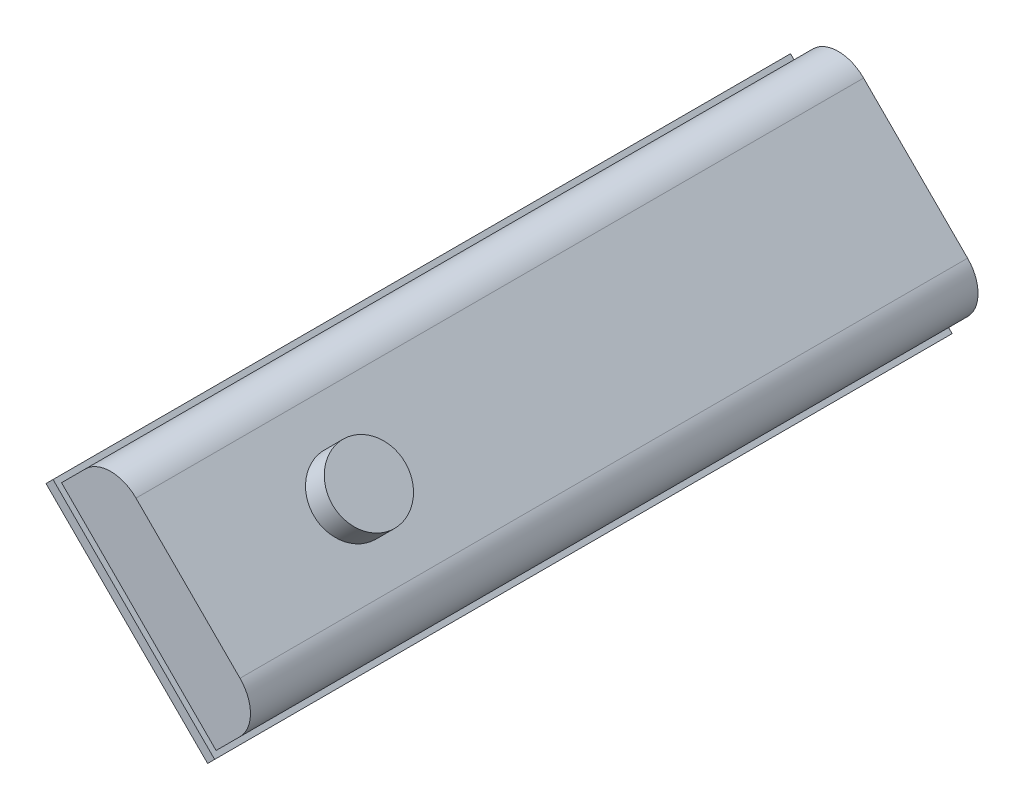
ISO-10303-21;
HEADER;
FILE_DESCRIPTION(('STEP AP214'),'2;1');
FILE_NAME('part.step','',(''),(''),'','','');
FILE_SCHEMA(('AUTOMOTIVE_DESIGN { 1 0 10303 214 1 1 1 1 }'));
ENDSEC;
DATA;
#1=APPLICATION_CONTEXT('core data for automotive mechanical design processes');
#2=APPLICATION_PROTOCOL_DEFINITION('international standard','automotive_design',2000,#1);
#3=PRODUCT_CONTEXT('',#1,'mechanical');
#4=PRODUCT('Part','Part','',(#3));
#5=PRODUCT_RELATED_PRODUCT_CATEGORY('part','',(#4));
#6=PRODUCT_DEFINITION_FORMATION('','',#4);
#7=PRODUCT_DEFINITION_CONTEXT('part definition',#1,'design');
#8=PRODUCT_DEFINITION('design','',#6,#7);
#9=PRODUCT_DEFINITION_SHAPE('','',#8);
#10=(LENGTH_UNIT() NAMED_UNIT(*) SI_UNIT(.MILLI.,.METRE.));
#11=(NAMED_UNIT(*) PLANE_ANGLE_UNIT() SI_UNIT($,.RADIAN.));
#12=(NAMED_UNIT(*) SI_UNIT($,.STERADIAN.) SOLID_ANGLE_UNIT());
#13=UNCERTAINTY_MEASURE_WITH_UNIT(LENGTH_MEASURE(1.E-05),#10,'distance_accuracy_value','');
#14=(GEOMETRIC_REPRESENTATION_CONTEXT(3) GLOBAL_UNCERTAINTY_ASSIGNED_CONTEXT((#13)) GLOBAL_UNIT_ASSIGNED_CONTEXT((#10,
#11,#12)) REPRESENTATION_CONTEXT('',''));
#15=CARTESIAN_POINT('',(0.,0.,0.));
#16=DIRECTION('',(0.,0.,1.));
#17=DIRECTION('',(1.,0.,0.));
#18=AXIS2_PLACEMENT_3D('',#15,#16,#17);
#19=CARTESIAN_POINT('',(212.37952172938,305.717616846004,63.9000000000001));
#20=DIRECTION('',(0.707106781186548,-0.707106781186547,0.));
#21=DIRECTION('',(0.707106781186547,0.707106781186548,0.));
#22=AXIS2_PLACEMENT_3D('',#19,#20,#21);
#23=PLANE('',#22);
#24=DIRECTION('',(0.,0.,-1.));
#25=VECTOR('',#24,1.);
#26=CARTESIAN_POINT('',(197.954543393174,291.292638509798,63.9000000000001));
#27=LINE('',#26,#25);
#28=CARTESIAN_POINT('',(197.954543393174,291.292638509798,63.9000000000001));
#29=VERTEX_POINT('',#28);
#30=CARTESIAN_POINT('',(197.954543393174,291.292638509798,-375.38));
#31=VERTEX_POINT('',#30);
#32=EDGE_CURVE('E67',#29,#31,#27,.T.);
#33=ORIENTED_EDGE('',*,*,#32,.F.);
#34=DIRECTION('',(-0.707106781186547,-0.707106781186548,0.));
#35=VECTOR('',#34,1.);
#36=CARTESIAN_POINT('',(212.37952172938,305.717616846004,63.9000000000001));
#37=LINE('',#36,#35);
#38=CARTESIAN_POINT('',(212.37952172938,305.717616846004,63.9000000000001));
#39=VERTEX_POINT('',#38);
#40=EDGE_CURVE('E156',#39,#29,#37,.T.);
#41=ORIENTED_EDGE('',*,*,#40,.F.);
#42=DIRECTION('',(0.,0.,-1.));
#43=VECTOR('',#42,1.);
#44=CARTESIAN_POINT('',(212.37952172938,305.717616846004,63.9000000000001));
#45=LINE('',#44,#43);
#46=CARTESIAN_POINT('',(212.37952172938,305.717616846004,-375.38));
#47=VERTEX_POINT('',#46);
#48=EDGE_CURVE('E167',#39,#47,#45,.T.);
#49=ORIENTED_EDGE('',*,*,#48,.T.);
#50=DIRECTION('',(-0.707106781186547,-0.707106781186548,0.));
#51=VECTOR('',#50,1.);
#52=CARTESIAN_POINT('',(212.37952172938,305.717616846004,-375.38));
#53=LINE('',#52,#51);
#54=EDGE_CURVE('E159',#47,#31,#53,.T.);
#55=ORIENTED_EDGE('',*,*,#54,.T.);
#56=EDGE_LOOP('',(#33,#41,#49,#55));
#57=FACE_BOUND('',#56,.T.);
#58=ADVANCED_FACE('F44',(#57),#23,.F.);
#59=CARTESIAN_POINT('',(287.049997822679,193.711902706055,63.9000000000001));
#60=DIRECTION('',(-0.707106781186547,0.707106781186548,0.));
#61=DIRECTION('',(-0.707106781186548,-0.707106781186547,0.));
#62=AXIS2_PLACEMENT_3D('',#59,#60,#61);
#63=PLANE('',#62);
#64=DIRECTION('',(0.,0.,1.));
#65=VECTOR('',#64,1.);
#66=CARTESIAN_POINT('',(291.292638509798,197.954543393174,63.9000000000001));
#67=LINE('',#66,#65);
#68=CARTESIAN_POINT('',(291.292638509798,197.954543393174,-375.38));
#69=VERTEX_POINT('',#68);
#70=CARTESIAN_POINT('',(291.292638509798,197.954543393174,63.9000000000001));
#71=VERTEX_POINT('',#70);
#72=EDGE_CURVE('E147',#69,#71,#67,.T.);
#73=ORIENTED_EDGE('',*,*,#72,.F.);
#74=DIRECTION('',(0.707106781186548,0.707106781186547,0.));
#75=VECTOR('',#74,1.);
#76=CARTESIAN_POINT('',(287.049997822679,193.711902706055,-375.38));
#77=LINE('',#76,#75);
#78=CARTESIAN_POINT('',(305.717616846004,212.37952172938,-375.38));
#79=VERTEX_POINT('',#78);
#80=EDGE_CURVE('E175',#69,#79,#77,.T.);
#81=ORIENTED_EDGE('',*,*,#80,.T.);
#82=DIRECTION('',(0.,0.,-1.));
#83=VECTOR('',#82,1.);
#84=CARTESIAN_POINT('',(305.717616846004,212.37952172938,63.9000000000001));
#85=LINE('',#84,#83);
#86=CARTESIAN_POINT('',(305.717616846004,212.37952172938,63.9000000000001));
#87=VERTEX_POINT('',#86);
#88=EDGE_CURVE('E190',#87,#79,#85,.T.);
#89=ORIENTED_EDGE('',*,*,#88,.F.);
#90=DIRECTION('',(0.707106781186548,0.707106781186547,0.));
#91=VECTOR('',#90,1.);
#92=CARTESIAN_POINT('',(287.049997822679,193.711902706055,63.9000000000001));
#93=LINE('',#92,#91);
#94=EDGE_CURVE('E163',#71,#87,#93,.T.);
#95=ORIENTED_EDGE('',*,*,#94,.F.);
#96=EDGE_LOOP('',(#73,#81,#89,#95));
#97=FACE_BOUND('',#96,.T.);
#98=ADVANCED_FACE('F213',(#97),#63,.F.);
#99=CARTESIAN_POINT('',(290.444110372374,227.653028203009,63.9000000000001));
#100=DIRECTION('',(0.,0.,1.));
#101=DIRECTION('',(1.,0.,0.));
#102=AXIS2_PLACEMENT_3D('',#99,#100,#101);
#103=PLANE('',#102);
#104=ORIENTED_EDGE('',*,*,#40,.T.);
#105=DIRECTION('',(0.707106781186548,-0.707106781186548,0.));
#106=VECTOR('',#105,1.);
#107=CARTESIAN_POINT('',(276.019132036169,213.228049866803,63.9000000000001));
#108=LINE('',#107,#106);
#109=EDGE_CURVE('E56',#29,#71,#108,.T.);
#110=ORIENTED_EDGE('',*,*,#109,.T.);
#111=ORIENTED_EDGE('',*,*,#94,.T.);
#112=CARTESIAN_POINT('',(290.444110372374,227.653028203009,63.9000000000001));
#113=DIRECTION('',(0.,0.,1.));
#114=DIRECTION('',(1.,0.,0.));
#115=AXIS2_PLACEMENT_3D('',#112,#113,#114);
#116=CIRCLE('',#115,21.6);
#117=CARTESIAN_POINT('',(305.717616846004,242.926534676638,63.9000000000001));
#118=VERTEX_POINT('',#117);
#119=EDGE_CURVE('E165',#87,#118,#116,.T.);
#120=ORIENTED_EDGE('',*,*,#119,.T.);
#121=DIRECTION('',(-0.707106781186548,0.707106781186548,0.));
#122=VECTOR('',#121,1.);
#123=CARTESIAN_POINT('',(305.717616846004,242.926534676638,63.9000000000001));
#124=LINE('',#123,#122);
#125=CARTESIAN_POINT('',(242.926534676638,305.717616846004,63.9000000000001));
#126=VERTEX_POINT('',#125);
#127=EDGE_CURVE('E168',#118,#126,#124,.T.);
#128=ORIENTED_EDGE('',*,*,#127,.T.);
#129=CARTESIAN_POINT('',(227.653028203009,290.444110372374,63.9000000000001));
#130=DIRECTION('',(0.,0.,1.));
#131=DIRECTION('',(1.,0.,0.));
#132=AXIS2_PLACEMENT_3D('',#129,#130,#131);
#133=CIRCLE('',#132,21.6);
#134=EDGE_CURVE('E166',#126,#39,#133,.T.);
#135=ORIENTED_EDGE('',*,*,#134,.T.);
#136=EDGE_LOOP('',(#104,#110,#111,#120,#128,#135));
#137=FACE_BOUND('',#136,.T.);
#138=ADVANCED_FACE('F214',(#137),#103,.T.);
#139=CARTESIAN_POINT('',(290.444110372374,227.653028203009,-375.38));
#140=DIRECTION('',(0.,0.,1.));
#141=DIRECTION('',(1.,0.,0.));
#142=AXIS2_PLACEMENT_3D('',#139,#140,#141);
#143=PLANE('',#142);
#144=DIRECTION('',(0.707106781186548,-0.707106781186548,0.));
#145=VECTOR('',#144,1.);
#146=CARTESIAN_POINT('',(276.019132036169,213.228049866803,-375.38));
#147=LINE('',#146,#145);
#148=EDGE_CURVE('E55',#31,#69,#147,.T.);
#149=ORIENTED_EDGE('',*,*,#148,.F.);
#150=ORIENTED_EDGE('',*,*,#54,.F.);
#151=CARTESIAN_POINT('',(227.653028203009,290.444110372374,-375.38));
#152=DIRECTION('',(0.,0.,1.));
#153=DIRECTION('',(1.,0.,0.));
#154=AXIS2_PLACEMENT_3D('',#151,#152,#153);
#155=CIRCLE('',#154,21.6);
#156=CARTESIAN_POINT('',(242.926534676638,305.717616846004,-375.38));
#157=VERTEX_POINT('',#156);
#158=EDGE_CURVE('E162',#157,#47,#155,.T.);
#159=ORIENTED_EDGE('',*,*,#158,.F.);
#160=DIRECTION('',(-0.707106781186548,0.707106781186548,0.));
#161=VECTOR('',#160,1.);
#162=CARTESIAN_POINT('',(305.717616846004,242.926534676638,-375.38));
#163=LINE('',#162,#161);
#164=CARTESIAN_POINT('',(305.717616846004,242.926534676638,-375.38));
#165=VERTEX_POINT('',#164);
#166=EDGE_CURVE('E176',#165,#157,#163,.T.);
#167=ORIENTED_EDGE('',*,*,#166,.F.);
#168=CARTESIAN_POINT('',(290.444110372374,227.653028203009,-375.38));
#169=DIRECTION('',(0.,0.,1.));
#170=DIRECTION('',(1.,0.,0.));
#171=AXIS2_PLACEMENT_3D('',#168,#169,#170);
#172=CIRCLE('',#171,21.6);
#173=EDGE_CURVE('E172',#79,#165,#172,.T.);
#174=ORIENTED_EDGE('',*,*,#173,.F.);
#175=ORIENTED_EDGE('',*,*,#80,.F.);
#176=EDGE_LOOP('',(#149,#150,#159,#167,#174,#175));
#177=FACE_BOUND('',#176,.T.);
#178=ADVANCED_FACE('F196',(#177),#143,.F.);
#179=CARTESIAN_POINT('',(290.444110372374,227.653028203009,63.9000000000001));
#180=DIRECTION('',(0.,0.,-1.));
#181=DIRECTION('',(-1.,0.,0.));
#182=AXIS2_PLACEMENT_3D('',#179,#180,#181);
#183=CYLINDRICAL_SURFACE('',#182,21.6);
#184=ORIENTED_EDGE('',*,*,#173,.T.);
#185=DIRECTION('',(0.,0.,-1.));
#186=VECTOR('',#185,1.);
#187=CARTESIAN_POINT('',(305.717616846004,242.926534676638,63.9000000000001));
#188=LINE('',#187,#186);
#189=EDGE_CURVE('E183',#118,#165,#188,.T.);
#190=ORIENTED_EDGE('',*,*,#189,.F.);
#191=ORIENTED_EDGE('',*,*,#119,.F.);
#192=ORIENTED_EDGE('',*,*,#88,.T.);
#193=EDGE_LOOP('',(#184,#190,#191,#192));
#194=FACE_BOUND('',#193,.T.);
#195=ADVANCED_FACE('F211',(#194),#183,.T.);
#196=CARTESIAN_POINT('',(305.717616846004,242.926534676638,63.9000000000001));
#197=DIRECTION('',(-0.707106781186548,-0.707106781186548,0.));
#198=DIRECTION('',(0.707106781186548,-0.707106781186548,0.));
#199=AXIS2_PLACEMENT_3D('',#196,#197,#198);
#200=PLANE('',#199);
#201=CARTESIAN_POINT('',(274.322075761321,274.322075761321,-34.));
#202=DIRECTION('',(-0.707106781186548,-0.707106781186548,0.));
#203=DIRECTION('',(0.707106781186548,-0.707106781186548,0.));
#204=AXIS2_PLACEMENT_3D('',#201,#202,#203);
#205=CIRCLE('',#204,22.);
#206=CARTESIAN_POINT('',(289.878424947425,258.765726575217,-34.));
#207=VERTEX_POINT('',#206);
#208=EDGE_CURVE('E11',#207,#207,#205,.F.);
#209=ORIENTED_EDGE('',*,*,#208,.F.);
#210=EDGE_LOOP('',(#209));
#211=FACE_BOUND('',#210,.T.);
#212=ORIENTED_EDGE('',*,*,#166,.T.);
#213=DIRECTION('',(0.,0.,-1.));
#214=VECTOR('',#213,1.);
#215=CARTESIAN_POINT('',(242.926534676638,305.717616846004,63.9000000000001));
#216=LINE('',#215,#214);
#217=EDGE_CURVE('E181',#126,#157,#216,.T.);
#218=ORIENTED_EDGE('',*,*,#217,.F.);
#219=ORIENTED_EDGE('',*,*,#127,.F.);
#220=ORIENTED_EDGE('',*,*,#189,.T.);
#221=EDGE_LOOP('',(#212,#218,#219,#220));
#222=FACE_BOUND('',#221,.T.);
#223=ADVANCED_FACE('F207',(#211,#222),#200,.F.);
#224=CARTESIAN_POINT('',(227.653028203009,290.444110372374,63.9000000000001));
#225=DIRECTION('',(0.,0.,-1.));
#226=DIRECTION('',(-1.,0.,0.));
#227=AXIS2_PLACEMENT_3D('',#224,#225,#226);
#228=CYLINDRICAL_SURFACE('',#227,21.6);
#229=ORIENTED_EDGE('',*,*,#158,.T.);
#230=ORIENTED_EDGE('',*,*,#48,.F.);
#231=ORIENTED_EDGE('',*,*,#134,.F.);
#232=ORIENTED_EDGE('',*,*,#217,.T.);
#233=EDGE_LOOP('',(#229,#230,#231,#232));
#234=FACE_BOUND('',#233,.T.);
#235=ADVANCED_FACE('F205',(#234),#228,.T.);
#236=CARTESIAN_POINT('',(195.833223049614,293.413958853358,66.9000000000001));
#237=DIRECTION('',(0.70710678118655,-0.707106781186545,0.));
#238=DIRECTION('',(0.707106781186545,0.70710678118655,0.));
#239=AXIS2_PLACEMENT_3D('',#236,#237,#238);
#240=PLANE('',#239);
#241=DIRECTION('',(-0.707106781186545,-0.70710678118655,0.));
#242=VECTOR('',#241,1.);
#243=CARTESIAN_POINT('',(195.833223049614,293.413958853358,-378.38));
#244=LINE('',#243,#242);
#245=CARTESIAN_POINT('',(195.833223049614,293.413958853358,-378.38));
#246=VERTEX_POINT('',#245);
#247=CARTESIAN_POINT('',(191.590582362495,289.171318166239,-378.38));
#248=VERTEX_POINT('',#247);
#249=EDGE_CURVE('E150',#246,#248,#244,.T.);
#250=ORIENTED_EDGE('',*,*,#249,.T.);
#251=DIRECTION('',(0.,0.,-1.));
#252=VECTOR('',#251,1.);
#253=CARTESIAN_POINT('',(191.590582362495,289.171318166239,66.9000000000001));
#254=LINE('',#253,#252);
#255=CARTESIAN_POINT('',(191.590582362495,289.171318166239,66.9000000000001));
#256=VERTEX_POINT('',#255);
#257=EDGE_CURVE('E130',#256,#248,#254,.T.);
#258=ORIENTED_EDGE('',*,*,#257,.F.);
#259=DIRECTION('',(-0.707106781186545,-0.70710678118655,0.));
#260=VECTOR('',#259,1.);
#261=CARTESIAN_POINT('',(195.833223049614,293.413958853358,66.9000000000001));
#262=LINE('',#261,#260);
#263=CARTESIAN_POINT('',(195.833223049614,293.413958853358,66.9000000000001));
#264=VERTEX_POINT('',#263);
#265=EDGE_CURVE('E133',#264,#256,#262,.T.);
#266=ORIENTED_EDGE('',*,*,#265,.F.);
#267=DIRECTION('',(0.,0.,-1.));
#268=VECTOR('',#267,1.);
#269=CARTESIAN_POINT('',(195.833223049614,293.413958853358,66.9000000000001));
#270=LINE('',#269,#268);
#271=EDGE_CURVE('E359',#264,#246,#270,.T.);
#272=ORIENTED_EDGE('',*,*,#271,.T.);
#273=EDGE_LOOP('',(#250,#258,#266,#272));
#274=FACE_BOUND('',#273,.T.);
#275=ADVANCED_FACE('F143',(#274),#240,.F.);
#276=CARTESIAN_POINT('',(289.171318166239,191.590582362495,66.9000000000001));
#277=DIRECTION('',(-0.707106781186545,0.70710678118655,0.));
#278=DIRECTION('',(-0.70710678118655,-0.707106781186545,0.));
#279=AXIS2_PLACEMENT_3D('',#276,#277,#278);
#280=PLANE('',#279);
#281=DIRECTION('',(0.70710678118655,0.707106781186545,0.));
#282=VECTOR('',#281,1.);
#283=CARTESIAN_POINT('',(289.171318166239,191.590582362495,-378.38));
#284=LINE('',#283,#282);
#285=CARTESIAN_POINT('',(289.171318166239,191.590582362495,-378.38));
#286=VERTEX_POINT('',#285);
#287=CARTESIAN_POINT('',(293.413958853358,195.833223049614,-378.38));
#288=VERTEX_POINT('',#287);
#289=EDGE_CURVE('E353',#286,#288,#284,.T.);
#290=ORIENTED_EDGE('',*,*,#289,.T.);
#291=DIRECTION('',(0.,0.,-1.));
#292=VECTOR('',#291,1.);
#293=CARTESIAN_POINT('',(293.413958853358,195.833223049614,66.9000000000001));
#294=LINE('',#293,#292);
#295=CARTESIAN_POINT('',(293.413958853358,195.833223049614,66.9000000000001));
#296=VERTEX_POINT('',#295);
#297=EDGE_CURVE('E152',#296,#288,#294,.T.);
#298=ORIENTED_EDGE('',*,*,#297,.F.);
#299=DIRECTION('',(0.70710678118655,0.707106781186545,0.));
#300=VECTOR('',#299,1.);
#301=CARTESIAN_POINT('',(289.171318166239,191.590582362495,66.9000000000001));
#302=LINE('',#301,#300);
#303=CARTESIAN_POINT('',(289.171318166239,191.590582362495,66.9000000000001));
#304=VERTEX_POINT('',#303);
#305=EDGE_CURVE('E134',#304,#296,#302,.T.);
#306=ORIENTED_EDGE('',*,*,#305,.F.);
#307=DIRECTION('',(0.,0.,-1.));
#308=VECTOR('',#307,1.);
#309=CARTESIAN_POINT('',(289.171318166239,191.590582362495,66.9000000000001));
#310=LINE('',#309,#308);
#311=EDGE_CURVE('E129',#304,#286,#310,.T.);
#312=ORIENTED_EDGE('',*,*,#311,.T.);
#313=EDGE_LOOP('',(#290,#298,#306,#312));
#314=FACE_BOUND('',#313,.T.);
#315=ADVANCED_FACE('F323',(#314),#280,.F.);
#316=CARTESIAN_POINT('',(293.413958853358,195.833223049614,66.9000000000001));
#317=DIRECTION('',(-0.707106781186547,-0.707106781186547,0.));
#318=DIRECTION('',(0.707106781186548,-0.707106781186548,0.));
#319=AXIS2_PLACEMENT_3D('',#316,#317,#318);
#320=PLANE('',#319);
#321=ORIENTED_EDGE('',*,*,#109,.F.);
#322=ORIENTED_EDGE('',*,*,#32,.T.);
#323=ORIENTED_EDGE('',*,*,#148,.T.);
#324=ORIENTED_EDGE('',*,*,#72,.T.);
#325=EDGE_LOOP('',(#321,#322,#323,#324));
#326=FACE_BOUND('',#325,.T.);
#327=DIRECTION('',(-0.707106781186547,0.707106781186547,0.));
#328=VECTOR('',#327,1.);
#329=CARTESIAN_POINT('',(293.413958853358,195.833223049614,-378.38));
#330=LINE('',#329,#328);
#331=EDGE_CURVE('E141',#288,#246,#330,.T.);
#332=ORIENTED_EDGE('',*,*,#331,.T.);
#333=ORIENTED_EDGE('',*,*,#271,.F.);
#334=DIRECTION('',(-0.707106781186547,0.707106781186547,0.));
#335=VECTOR('',#334,1.);
#336=CARTESIAN_POINT('',(293.413958853358,195.833223049614,66.9000000000001));
#337=LINE('',#336,#335);
#338=EDGE_CURVE('E136',#296,#264,#337,.T.);
#339=ORIENTED_EDGE('',*,*,#338,.F.);
#340=ORIENTED_EDGE('',*,*,#297,.T.);
#341=EDGE_LOOP('',(#332,#333,#339,#340));
#342=FACE_BOUND('',#341,.T.);
#343=ADVANCED_FACE('F191',(#326,#342),#320,.F.);
#344=CARTESIAN_POINT('',(0.,0.,66.9000000000001));
#345=DIRECTION('',(0.,0.,1.));
#346=DIRECTION('',(1.,0.,0.));
#347=AXIS2_PLACEMENT_3D('',#344,#345,#346);
#348=PLANE('',#347);
#349=ORIENTED_EDGE('',*,*,#265,.T.);
#350=DIRECTION('',(0.707106781186548,-0.707106781186548,0.));
#351=VECTOR('',#350,1.);
#352=CARTESIAN_POINT('',(191.590582362495,289.171318166239,66.9000000000001));
#353=LINE('',#352,#351);
#354=EDGE_CURVE('E124',#256,#304,#353,.T.);
#355=ORIENTED_EDGE('',*,*,#354,.T.);
#356=ORIENTED_EDGE('',*,*,#305,.T.);
#357=ORIENTED_EDGE('',*,*,#338,.T.);
#358=EDGE_LOOP('',(#349,#355,#356,#357));
#359=FACE_BOUND('',#358,.T.);
#360=ADVANCED_FACE('F140',(#359),#348,.T.);
#361=CARTESIAN_POINT('',(0.,0.,-378.38));
#362=DIRECTION('',(0.,0.,1.));
#363=DIRECTION('',(1.,0.,0.));
#364=AXIS2_PLACEMENT_3D('',#361,#362,#363);
#365=PLANE('',#364);
#366=ORIENTED_EDGE('',*,*,#249,.F.);
#367=ORIENTED_EDGE('',*,*,#331,.F.);
#368=ORIENTED_EDGE('',*,*,#289,.F.);
#369=DIRECTION('',(0.707106781186548,-0.707106781186548,0.));
#370=VECTOR('',#369,1.);
#371=CARTESIAN_POINT('',(191.590582362495,289.171318166239,-378.38));
#372=LINE('',#371,#370);
#373=EDGE_CURVE('E356',#248,#286,#372,.T.);
#374=ORIENTED_EDGE('',*,*,#373,.F.);
#375=EDGE_LOOP('',(#366,#367,#368,#374));
#376=FACE_BOUND('',#375,.T.);
#377=ADVANCED_FACE('F276',(#376),#365,.F.);
#378=CARTESIAN_POINT('',(193.711902706055,287.049997822679,63.9000000000001));
#379=DIRECTION('',(0.707106781186548,0.707106781186548,0.));
#380=DIRECTION('',(-0.707106781186548,0.707106781186548,0.));
#381=AXIS2_PLACEMENT_3D('',#378,#379,#380);
#382=PLANE('',#381);
#383=ORIENTED_EDGE('',*,*,#373,.T.);
#384=ORIENTED_EDGE('',*,*,#311,.F.);
#385=ORIENTED_EDGE('',*,*,#354,.F.);
#386=ORIENTED_EDGE('',*,*,#257,.T.);
#387=EDGE_LOOP('',(#383,#384,#385,#386));
#388=FACE_BOUND('',#387,.T.);
#389=ADVANCED_FACE('F123',(#388),#382,.F.);
#390=CARTESIAN_POINT('',(285.635784260306,285.635784260306,-34.));
#391=DIRECTION('',(-0.707106781186548,-0.707106781186547,0.));
#392=DIRECTION('',(0.707106781186547,-0.707106781186548,0.));
#393=AXIS2_PLACEMENT_3D('',#390,#391,#392);
#394=CYLINDRICAL_SURFACE('',#393,22.);
#395=CARTESIAN_POINT('',(285.635784260306,285.635784260306,-34.));
#396=DIRECTION('',(0.707106781186548,0.707106781186547,0.));
#397=DIRECTION('',(-0.707106781186547,0.707106781186548,0.));
#398=AXIS2_PLACEMENT_3D('',#395,#396,#397);
#399=CIRCLE('',#398,22.);
#400=CARTESIAN_POINT('',(270.079435074202,301.19213344641,-34.));
#401=VERTEX_POINT('',#400);
#402=EDGE_CURVE('E370',#401,#401,#399,.T.);
#403=ORIENTED_EDGE('',*,*,#402,.F.);
#404=EDGE_LOOP('',(#403));
#405=FACE_BOUND('',#404,.T.);
#406=ORIENTED_EDGE('',*,*,#208,.T.);
#407=EDGE_LOOP('',(#406));
#408=FACE_BOUND('',#407,.T.);
#409=ADVANCED_FACE('F273',(#405,#408),#394,.T.);
#410=CARTESIAN_POINT('',(285.635784260306,285.635784260306,-34.));
#411=DIRECTION('',(0.707106781186548,0.707106781186547,0.));
#412=DIRECTION('',(-0.707106781186547,0.707106781186548,0.));
#413=AXIS2_PLACEMENT_3D('',#410,#411,#412);
#414=PLANE('',#413);
#415=ORIENTED_EDGE('',*,*,#402,.T.);
#416=EDGE_LOOP('',(#415));
#417=FACE_BOUND('',#416,.T.);
#418=ADVANCED_FACE('F298',(#417),#414,.T.);
#419=CLOSED_SHELL('',(#58,#98,#138,#178,#195,#223,#235,#275,#315,#343,#360,#377,#389,#409,#418));
#420=MANIFOLD_SOLID_BREP('B2',#419);
#421=ADVANCED_BREP_SHAPE_REPRESENTATION('',(#18,#420),#14);
#422=SHAPE_DEFINITION_REPRESENTATION(#9,#421);
ENDSEC;
END-ISO-10303-21;
